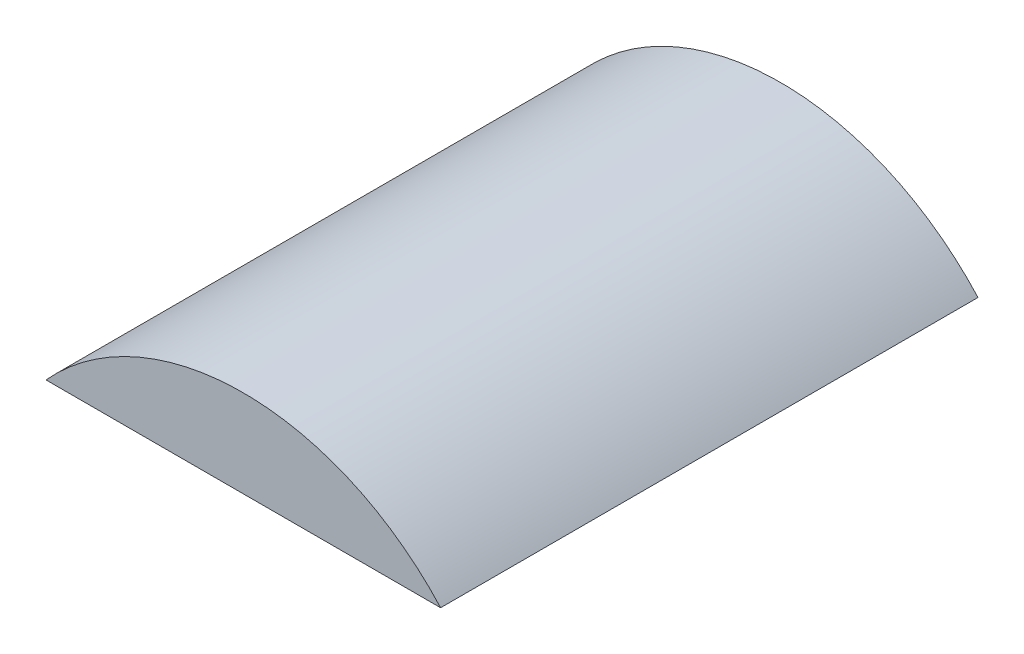
ISO-10303-21;
HEADER;
FILE_DESCRIPTION(('STEP AP214'),'2;1');
FILE_NAME('part.step','',(''),(''),'','','');
FILE_SCHEMA(('AUTOMOTIVE_DESIGN { 1 0 10303 214 1 1 1 1 }'));
ENDSEC;
DATA;
#1=APPLICATION_CONTEXT('core data for automotive mechanical design processes');
#2=APPLICATION_PROTOCOL_DEFINITION('international standard','automotive_design',2000,#1);
#3=PRODUCT_CONTEXT('',#1,'mechanical');
#4=PRODUCT('Part','Part','',(#3));
#5=PRODUCT_RELATED_PRODUCT_CATEGORY('part','',(#4));
#6=PRODUCT_DEFINITION_FORMATION('','',#4);
#7=PRODUCT_DEFINITION_CONTEXT('part definition',#1,'design');
#8=PRODUCT_DEFINITION('design','',#6,#7);
#9=PRODUCT_DEFINITION_SHAPE('','',#8);
#10=(LENGTH_UNIT() NAMED_UNIT(*) SI_UNIT(.MILLI.,.METRE.));
#11=(NAMED_UNIT(*) PLANE_ANGLE_UNIT() SI_UNIT($,.RADIAN.));
#12=(NAMED_UNIT(*) SI_UNIT($,.STERADIAN.) SOLID_ANGLE_UNIT());
#13=UNCERTAINTY_MEASURE_WITH_UNIT(LENGTH_MEASURE(1.E-05),#10,'distance_accuracy_value','');
#14=(GEOMETRIC_REPRESENTATION_CONTEXT(3) GLOBAL_UNCERTAINTY_ASSIGNED_CONTEXT((#13)) GLOBAL_UNIT_ASSIGNED_CONTEXT((#10,
#11,#12)) REPRESENTATION_CONTEXT('',''));
#15=CARTESIAN_POINT('',(0.,0.,0.));
#16=DIRECTION('',(0.,0.,1.));
#17=DIRECTION('',(1.,0.,0.));
#18=AXIS2_PLACEMENT_3D('',#15,#16,#17);
#19=CARTESIAN_POINT('',(-25.,33.2439994182172,-100.));
#20=DIRECTION('',(0.,0.,-1.));
#21=DIRECTION('',(-1.,0.,0.));
#22=AXIS2_PLACEMENT_3D('',#19,#20,#21);
#23=PLANE('',#22);
#24=CARTESIAN_POINT('',(0.,0.,-100.));
#25=DIRECTION('',(0.,0.,-1.));
#26=DIRECTION('',(-1.,0.,0.));
#27=AXIS2_PLACEMENT_3D('',#24,#25,#26);
#28=CIRCLE('',#27,49.53);
#29=CARTESIAN_POINT('',(36.7159012238781,33.2439994182172,-100.));
#30=VERTEX_POINT('',#29);
#31=CARTESIAN_POINT('',(-36.7159012238782,33.2439994182172,-100.));
#32=VERTEX_POINT('',#31);
#33=EDGE_CURVE('E65',#30,#32,#28,.F.);
#34=ORIENTED_EDGE('',*,*,#33,.F.);
#35=DIRECTION('',(-1.,0.,0.));
#36=VECTOR('',#35,1.);
#37=CARTESIAN_POINT('',(36.7159012238782,33.2439994182172,-100.));
#38=LINE('',#37,#36);
#39=EDGE_CURVE('E62',#30,#32,#38,.T.);
#40=ORIENTED_EDGE('',*,*,#39,.T.);
#41=EDGE_LOOP('',(#34,#40));
#42=FACE_BOUND('',#41,.T.);
#43=ADVANCED_FACE('F39',(#42),#23,.T.);
#44=CARTESIAN_POINT('',(0.,0.,0.));
#45=DIRECTION('',(0.,0.,1.));
#46=DIRECTION('',(1.,0.,0.));
#47=AXIS2_PLACEMENT_3D('',#44,#45,#46);
#48=PLANE('',#47);
#49=DIRECTION('',(-1.,0.,0.));
#50=VECTOR('',#49,1.);
#51=CARTESIAN_POINT('',(36.7159012238781,33.2439994182172,0.));
#52=LINE('',#51,#50);
#53=CARTESIAN_POINT('',(36.7159012238781,33.2439994182172,0.));
#54=VERTEX_POINT('',#53);
#55=CARTESIAN_POINT('',(-36.7159012238782,33.2439994182172,0.));
#56=VERTEX_POINT('',#55);
#57=EDGE_CURVE('E11',#54,#56,#52,.T.);
#58=ORIENTED_EDGE('',*,*,#57,.F.);
#59=CARTESIAN_POINT('',(0.,0.,0.));
#60=DIRECTION('',(0.,0.,1.));
#61=DIRECTION('',(1.,0.,0.));
#62=AXIS2_PLACEMENT_3D('',#59,#60,#61);
#63=CIRCLE('',#62,49.53);
#64=EDGE_CURVE('E68',#54,#56,#63,.T.);
#65=ORIENTED_EDGE('',*,*,#64,.T.);
#66=EDGE_LOOP('',(#58,#65));
#67=FACE_BOUND('',#66,.T.);
#68=ADVANCED_FACE('F77',(#67),#48,.T.);
#69=CARTESIAN_POINT('',(0.,0.,-175.216111476705));
#70=DIRECTION('',(0.,0.,1.));
#71=DIRECTION('',(1.,0.,0.));
#72=AXIS2_PLACEMENT_3D('',#69,#70,#71);
#73=CYLINDRICAL_SURFACE('',#72,49.53);
#74=DIRECTION('',(0.,0.,1.));
#75=VECTOR('',#74,1.);
#76=CARTESIAN_POINT('',(36.7159012238781,33.2439994182172,-175.216111476705));
#77=LINE('',#76,#75);
#78=EDGE_CURVE('E42',#30,#54,#77,.T.);
#79=ORIENTED_EDGE('',*,*,#78,.F.);
#80=ORIENTED_EDGE('',*,*,#33,.T.);
#81=DIRECTION('',(0.,0.,1.));
#82=VECTOR('',#81,1.);
#83=CARTESIAN_POINT('',(-36.7159012238782,33.2439994182172,-175.216111476705));
#84=LINE('',#83,#82);
#85=EDGE_CURVE('E67',#32,#56,#84,.T.);
#86=ORIENTED_EDGE('',*,*,#85,.T.);
#87=ORIENTED_EDGE('',*,*,#64,.F.);
#88=EDGE_LOOP('',(#79,#80,#86,#87));
#89=FACE_BOUND('',#88,.T.);
#90=ADVANCED_FACE('F73',(#89),#73,.T.);
#91=CARTESIAN_POINT('',(36.7159012238781,33.2439994182172,-175.216111476705));
#92=DIRECTION('',(0.,1.,0.));
#93=DIRECTION('',(-1.,0.,0.));
#94=AXIS2_PLACEMENT_3D('',#91,#92,#93);
#95=PLANE('',#94);
#96=ORIENTED_EDGE('',*,*,#39,.F.);
#97=ORIENTED_EDGE('',*,*,#78,.T.);
#98=ORIENTED_EDGE('',*,*,#57,.T.);
#99=ORIENTED_EDGE('',*,*,#85,.F.);
#100=EDGE_LOOP('',(#96,#97,#98,#99));
#101=FACE_BOUND('',#100,.T.);
#102=ADVANCED_FACE('F70',(#101),#95,.F.);
#103=CLOSED_SHELL('',(#43,#68,#90,#102));
#104=MANIFOLD_SOLID_BREP('B2',#103);
#105=ADVANCED_BREP_SHAPE_REPRESENTATION('',(#18,#104),#14);
#106=SHAPE_DEFINITION_REPRESENTATION(#9,#105);
ENDSEC;
END-ISO-10303-21;
